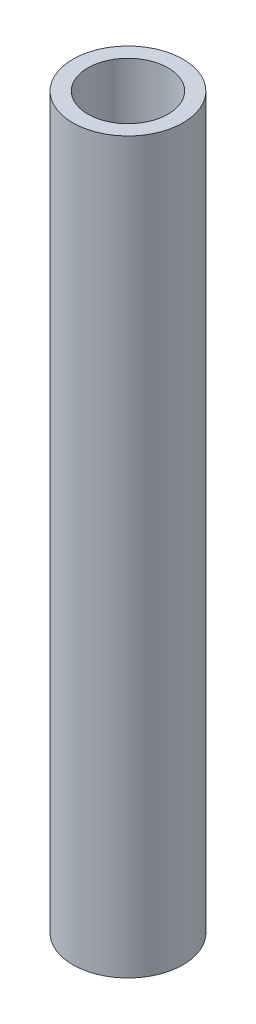
ISO-10303-21;
HEADER;
FILE_DESCRIPTION(('STEP AP214'),'2;1');
FILE_NAME('part.step','',(''),(''),'','','');
FILE_SCHEMA(('AUTOMOTIVE_DESIGN { 1 0 10303 214 1 1 1 1 }'));
ENDSEC;
DATA;
#1=APPLICATION_CONTEXT('core data for automotive mechanical design processes');
#2=APPLICATION_PROTOCOL_DEFINITION('international standard','automotive_design',2000,#1);
#3=PRODUCT_CONTEXT('',#1,'mechanical');
#4=PRODUCT('Part','Part','',(#3));
#5=PRODUCT_RELATED_PRODUCT_CATEGORY('part','',(#4));
#6=PRODUCT_DEFINITION_FORMATION('','',#4);
#7=PRODUCT_DEFINITION_CONTEXT('part definition',#1,'design');
#8=PRODUCT_DEFINITION('design','',#6,#7);
#9=PRODUCT_DEFINITION_SHAPE('','',#8);
#10=(LENGTH_UNIT() NAMED_UNIT(*) SI_UNIT(.MILLI.,.METRE.));
#11=(NAMED_UNIT(*) PLANE_ANGLE_UNIT() SI_UNIT($,.RADIAN.));
#12=(NAMED_UNIT(*) SI_UNIT($,.STERADIAN.) SOLID_ANGLE_UNIT());
#13=UNCERTAINTY_MEASURE_WITH_UNIT(LENGTH_MEASURE(1.E-05),#10,'distance_accuracy_value','');
#14=(GEOMETRIC_REPRESENTATION_CONTEXT(3) GLOBAL_UNCERTAINTY_ASSIGNED_CONTEXT((#13)) GLOBAL_UNIT_ASSIGNED_CONTEXT((#10,
#11,#12)) REPRESENTATION_CONTEXT('',''));
#15=CARTESIAN_POINT('',(0.,0.,0.));
#16=DIRECTION('',(0.,0.,1.));
#17=DIRECTION('',(1.,0.,0.));
#18=AXIS2_PLACEMENT_3D('',#15,#16,#17);
#19=CARTESIAN_POINT('',(0.,110.49,0.));
#20=DIRECTION('',(0.,1.,0.));
#21=DIRECTION('',(0.,0.,1.));
#22=AXIS2_PLACEMENT_3D('',#19,#20,#21);
#23=PLANE('',#22);
#24=CARTESIAN_POINT('',(0.,110.49,0.));
#25=DIRECTION('',(0.,1.,0.));
#26=DIRECTION('',(0.,0.,1.));
#27=AXIS2_PLACEMENT_3D('',#24,#25,#26);
#28=CIRCLE('',#27,16.7005);
#29=CARTESIAN_POINT('',(0.,110.49,16.7005));
#30=VERTEX_POINT('',#29);
#31=EDGE_CURVE('E10',#30,#30,#28,.T.);
#32=ORIENTED_EDGE('',*,*,#31,.T.);
#33=EDGE_LOOP('',(#32));
#34=FACE_BOUND('',#33,.T.);
#35=CARTESIAN_POINT('',(0.,110.49,0.));
#36=DIRECTION('',(0.,1.,0.));
#37=DIRECTION('',(0.,0.,1.));
#38=AXIS2_PLACEMENT_3D('',#35,#36,#37);
#39=CIRCLE('',#38,12.1539);
#40=CARTESIAN_POINT('',(0.,110.49,12.1539));
#41=VERTEX_POINT('',#40);
#42=EDGE_CURVE('E42',#41,#41,#39,.T.);
#43=ORIENTED_EDGE('',*,*,#42,.F.);
#44=EDGE_LOOP('',(#43));
#45=FACE_BOUND('',#44,.T.);
#46=ADVANCED_FACE('F31',(#34,#45),#23,.T.);
#47=CARTESIAN_POINT('',(0.,-110.49,0.));
#48=DIRECTION('',(0.,1.,0.));
#49=DIRECTION('',(0.,0.,1.));
#50=AXIS2_PLACEMENT_3D('',#47,#48,#49);
#51=PLANE('',#50);
#52=CARTESIAN_POINT('',(0.,-110.49,0.));
#53=DIRECTION('',(0.,1.,0.));
#54=DIRECTION('',(0.,0.,1.));
#55=AXIS2_PLACEMENT_3D('',#52,#53,#54);
#56=CIRCLE('',#55,16.7005);
#57=CARTESIAN_POINT('',(0.,-110.49,16.7005));
#58=VERTEX_POINT('',#57);
#59=EDGE_CURVE('E35',#58,#58,#56,.T.);
#60=ORIENTED_EDGE('',*,*,#59,.F.);
#61=EDGE_LOOP('',(#60));
#62=FACE_BOUND('',#61,.T.);
#63=CARTESIAN_POINT('',(0.,-110.49,0.));
#64=DIRECTION('',(0.,1.,0.));
#65=DIRECTION('',(0.,0.,1.));
#66=AXIS2_PLACEMENT_3D('',#63,#64,#65);
#67=CIRCLE('',#66,12.1539);
#68=CARTESIAN_POINT('',(0.,-110.49,12.1539));
#69=VERTEX_POINT('',#68);
#70=EDGE_CURVE('E44',#69,#69,#67,.T.);
#71=ORIENTED_EDGE('',*,*,#70,.T.);
#72=EDGE_LOOP('',(#71));
#73=FACE_BOUND('',#72,.T.);
#74=ADVANCED_FACE('F54',(#62,#73),#51,.F.);
#75=CARTESIAN_POINT('',(0.,110.49,0.));
#76=DIRECTION('',(0.,-1.,0.));
#77=DIRECTION('',(0.,0.,-1.));
#78=AXIS2_PLACEMENT_3D('',#75,#76,#77);
#79=CYLINDRICAL_SURFACE('',#78,16.7005);
#80=ORIENTED_EDGE('',*,*,#31,.F.);
#81=EDGE_LOOP('',(#80));
#82=FACE_BOUND('',#81,.T.);
#83=ORIENTED_EDGE('',*,*,#59,.T.);
#84=EDGE_LOOP('',(#83));
#85=FACE_BOUND('',#84,.T.);
#86=ADVANCED_FACE('F33',(#82,#85),#79,.T.);
#87=CARTESIAN_POINT('',(0.,110.49,0.));
#88=DIRECTION('',(0.,-1.,0.));
#89=DIRECTION('',(0.,0.,-1.));
#90=AXIS2_PLACEMENT_3D('',#87,#88,#89);
#91=CYLINDRICAL_SURFACE('',#90,12.1539);
#92=ORIENTED_EDGE('',*,*,#42,.T.);
#93=EDGE_LOOP('',(#92));
#94=FACE_BOUND('',#93,.T.);
#95=ORIENTED_EDGE('',*,*,#70,.F.);
#96=EDGE_LOOP('',(#95));
#97=FACE_BOUND('',#96,.T.);
#98=ADVANCED_FACE('F50',(#94,#97),#91,.F.);
#99=CLOSED_SHELL('',(#46,#74,#86,#98));
#100=MANIFOLD_SOLID_BREP('B2',#99);
#101=ADVANCED_BREP_SHAPE_REPRESENTATION('',(#18,#100),#14);
#102=SHAPE_DEFINITION_REPRESENTATION(#9,#101);
ENDSEC;
END-ISO-10303-21;
